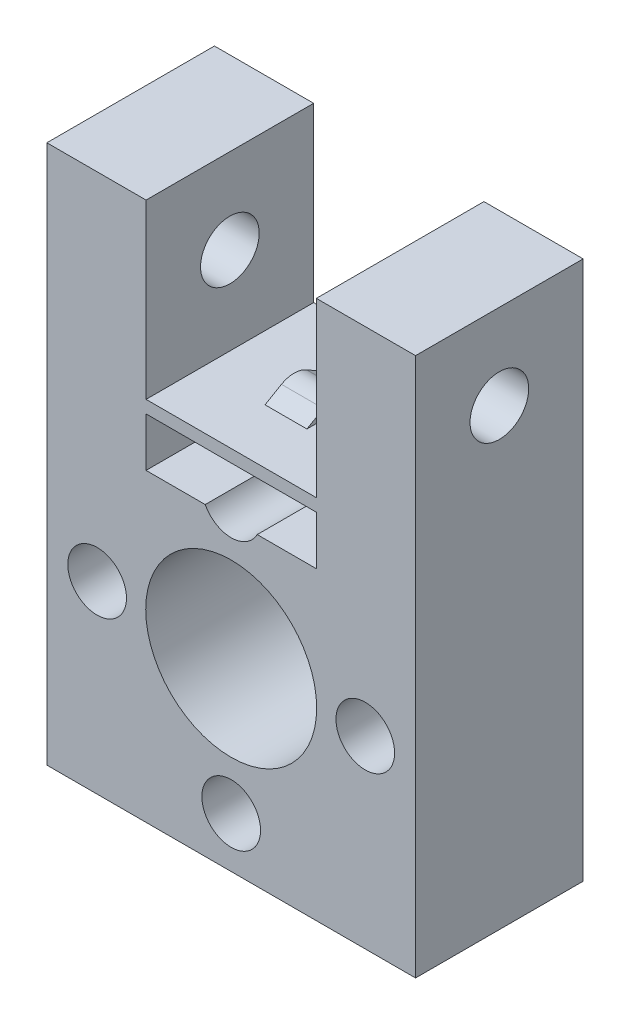
ISO-10303-21;
HEADER;
FILE_DESCRIPTION(('STEP AP214'),'2;1');
FILE_NAME('part.step','',(''),(''),'','','');
FILE_SCHEMA(('AUTOMOTIVE_DESIGN { 1 0 10303 214 1 1 1 1 }'));
ENDSEC;
DATA;
#1=APPLICATION_CONTEXT('core data for automotive mechanical design processes');
#2=APPLICATION_PROTOCOL_DEFINITION('international standard','automotive_design',2000,#1);
#3=PRODUCT_CONTEXT('',#1,'mechanical');
#4=PRODUCT('Part','Part','',(#3));
#5=PRODUCT_RELATED_PRODUCT_CATEGORY('part','',(#4));
#6=PRODUCT_DEFINITION_FORMATION('','',#4);
#7=PRODUCT_DEFINITION_CONTEXT('part definition',#1,'design');
#8=PRODUCT_DEFINITION('design','',#6,#7);
#9=PRODUCT_DEFINITION_SHAPE('','',#8);
#10=(LENGTH_UNIT() NAMED_UNIT(*) SI_UNIT(.MILLI.,.METRE.));
#11=(NAMED_UNIT(*) PLANE_ANGLE_UNIT() SI_UNIT($,.RADIAN.));
#12=(NAMED_UNIT(*) SI_UNIT($,.STERADIAN.) SOLID_ANGLE_UNIT());
#13=UNCERTAINTY_MEASURE_WITH_UNIT(LENGTH_MEASURE(1.E-05),#10,'distance_accuracy_value','');
#14=(GEOMETRIC_REPRESENTATION_CONTEXT(3) GLOBAL_UNCERTAINTY_ASSIGNED_CONTEXT((#13)) GLOBAL_UNIT_ASSIGNED_CONTEXT((#10,
#11,#12)) REPRESENTATION_CONTEXT('',''));
#15=CARTESIAN_POINT('',(0.,0.,0.));
#16=DIRECTION('',(0.,0.,1.));
#17=DIRECTION('',(1.,0.,0.));
#18=AXIS2_PLACEMENT_3D('',#15,#16,#17);
#19=CARTESIAN_POINT('',(5.08,21.16,0.));
#20=DIRECTION('',(1.,0.,0.));
#21=DIRECTION('',(0.,1.,0.));
#22=AXIS2_PLACEMENT_3D('',#19,#20,#21);
#23=PLANE('',#22);
#24=DIRECTION('',(0.,0.,1.));
#25=VECTOR('',#24,1.);
#26=CARTESIAN_POINT('',(5.08,10.11,0.));
#27=LINE('',#26,#25);
#28=CARTESIAN_POINT('',(5.08,10.11,0.));
#29=VERTEX_POINT('',#28);
#30=CARTESIAN_POINT('',(5.08,10.11,10.));
#31=VERTEX_POINT('',#30);
#32=EDGE_CURVE('E248',#29,#31,#27,.T.);
#33=ORIENTED_EDGE('',*,*,#32,.F.);
#34=DIRECTION('',(0.,1.,0.));
#35=VECTOR('',#34,1.);
#36=CARTESIAN_POINT('',(5.08,21.16,0.));
#37=LINE('',#36,#35);
#38=CARTESIAN_POINT('',(5.08,7.19,0.));
#39=VERTEX_POINT('',#38);
#40=EDGE_CURVE('E292',#39,#29,#37,.T.);
#41=ORIENTED_EDGE('',*,*,#40,.F.);
#42=DIRECTION('',(0.,0.,1.));
#43=VECTOR('',#42,1.);
#44=CARTESIAN_POINT('',(5.08,7.19,0.));
#45=LINE('',#44,#43);
#46=CARTESIAN_POINT('',(5.08,7.19,10.));
#47=VERTEX_POINT('',#46);
#48=EDGE_CURVE('E318',#39,#47,#45,.T.);
#49=ORIENTED_EDGE('',*,*,#48,.T.);
#50=DIRECTION('',(0.,1.,0.));
#51=VECTOR('',#50,1.);
#52=CARTESIAN_POINT('',(5.08,21.16,10.));
#53=LINE('',#52,#51);
#54=EDGE_CURVE('E306',#47,#31,#53,.T.);
#55=ORIENTED_EDGE('',*,*,#54,.T.);
#56=EDGE_LOOP('',(#33,#41,#49,#55));
#57=FACE_BOUND('',#56,.T.);
#58=ADVANCED_FACE('F67',(#57),#23,.F.);
#59=CARTESIAN_POINT('',(-5.08,21.16,0.));
#60=DIRECTION('',(-1.,0.,0.));
#61=DIRECTION('',(0.,-1.,0.));
#62=AXIS2_PLACEMENT_3D('',#59,#60,#61);
#63=PLANE('',#62);
#64=DIRECTION('',(0.,0.,-1.));
#65=VECTOR('',#64,1.);
#66=CARTESIAN_POINT('',(-5.08,10.11,0.));
#67=LINE('',#66,#65);
#68=CARTESIAN_POINT('',(-5.08,10.11,10.));
#69=VERTEX_POINT('',#68);
#70=CARTESIAN_POINT('',(-5.08,10.11,0.));
#71=VERTEX_POINT('',#70);
#72=EDGE_CURVE('E409',#69,#71,#67,.T.);
#73=ORIENTED_EDGE('',*,*,#72,.F.);
#74=DIRECTION('',(0.,-1.,0.));
#75=VECTOR('',#74,1.);
#76=CARTESIAN_POINT('',(-5.08,21.16,10.));
#77=LINE('',#76,#75);
#78=CARTESIAN_POINT('',(-5.08,7.19,10.));
#79=VERTEX_POINT('',#78);
#80=EDGE_CURVE('E280',#69,#79,#77,.T.);
#81=ORIENTED_EDGE('',*,*,#80,.T.);
#82=DIRECTION('',(0.,0.,1.));
#83=VECTOR('',#82,1.);
#84=CARTESIAN_POINT('',(-5.08,7.19,0.));
#85=LINE('',#84,#83);
#86=CARTESIAN_POINT('',(-5.08,7.19,0.));
#87=VERTEX_POINT('',#86);
#88=EDGE_CURVE('E296',#87,#79,#85,.T.);
#89=ORIENTED_EDGE('',*,*,#88,.F.);
#90=DIRECTION('',(0.,-1.,0.));
#91=VECTOR('',#90,1.);
#92=CARTESIAN_POINT('',(-5.08,21.16,0.));
#93=LINE('',#92,#91);
#94=EDGE_CURVE('E286',#71,#87,#93,.T.);
#95=ORIENTED_EDGE('',*,*,#94,.F.);
#96=EDGE_LOOP('',(#73,#81,#89,#95));
#97=FACE_BOUND('',#96,.T.);
#98=ADVANCED_FACE('F431',(#97),#63,.F.);
#99=CARTESIAN_POINT('',(0.,21.16,0.));
#100=DIRECTION('',(0.,-1.,0.));
#101=DIRECTION('',(0.,0.,-1.));
#102=AXIS2_PLACEMENT_3D('',#99,#100,#101);
#103=PLANE('',#102);
#104=DIRECTION('',(1.,0.,0.));
#105=VECTOR('',#104,1.);
#106=CARTESIAN_POINT('',(-11.,21.16,10.));
#107=LINE('',#106,#105);
#108=CARTESIAN_POINT('',(-11.,21.16,10.));
#109=VERTEX_POINT('',#108);
#110=CARTESIAN_POINT('',(-5.08,21.16,10.));
#111=VERTEX_POINT('',#110);
#112=EDGE_CURVE('E325',#109,#111,#107,.T.);
#113=ORIENTED_EDGE('',*,*,#112,.T.);
#114=DIRECTION('',(0.,0.,1.));
#115=VECTOR('',#114,1.);
#116=CARTESIAN_POINT('',(-5.08,21.16,0.));
#117=LINE('',#116,#115);
#118=CARTESIAN_POINT('',(-5.08,21.16,0.));
#119=VERTEX_POINT('',#118);
#120=EDGE_CURVE('E310',#119,#111,#117,.T.);
#121=ORIENTED_EDGE('',*,*,#120,.F.);
#122=DIRECTION('',(1.,0.,0.));
#123=VECTOR('',#122,1.);
#124=CARTESIAN_POINT('',(-11.,21.16,0.));
#125=LINE('',#124,#123);
#126=CARTESIAN_POINT('',(-11.,21.16,0.));
#127=VERTEX_POINT('',#126);
#128=EDGE_CURVE('E334',#127,#119,#125,.T.);
#129=ORIENTED_EDGE('',*,*,#128,.F.);
#130=DIRECTION('',(0.,0.,1.));
#131=VECTOR('',#130,1.);
#132=CARTESIAN_POINT('',(-11.,21.16,0.));
#133=LINE('',#132,#131);
#134=EDGE_CURVE('E338',#127,#109,#133,.T.);
#135=ORIENTED_EDGE('',*,*,#134,.T.);
#136=EDGE_LOOP('',(#113,#121,#129,#135));
#137=FACE_BOUND('',#136,.T.);
#138=ADVANCED_FACE('F474',(#137),#103,.F.);
#139=CARTESIAN_POINT('',(0.,0.,10.));
#140=DIRECTION('',(0.,0.,1.));
#141=DIRECTION('',(1.,0.,0.));
#142=AXIS2_PLACEMENT_3D('',#139,#140,#141);
#143=PLANE('',#142);
#144=DIRECTION('',(1.,0.,0.));
#145=VECTOR('',#144,1.);
#146=CARTESIAN_POINT('',(-11.,10.11,10.));
#147=LINE('',#146,#145);
#148=EDGE_CURVE('E240',#69,#31,#147,.T.);
#149=ORIENTED_EDGE('',*,*,#148,.T.);
#150=ORIENTED_EDGE('',*,*,#54,.F.);
#151=DIRECTION('',(1.,0.,0.));
#152=VECTOR('',#151,1.);
#153=CARTESIAN_POINT('',(-5.08,7.19,10.));
#154=LINE('',#153,#152);
#155=CARTESIAN_POINT('',(1.55125755437322,7.19,10.));
#156=VERTEX_POINT('',#155);
#157=EDGE_CURVE('E301',#156,#47,#154,.T.);
#158=ORIENTED_EDGE('',*,*,#157,.F.);
#159=CARTESIAN_POINT('',(0.,8.,10.));
#160=DIRECTION('',(0.,0.,1.));
#161=DIRECTION('',(1.,0.,0.));
#162=AXIS2_PLACEMENT_3D('',#159,#160,#161);
#163=CIRCLE('',#162,1.75);
#164=CARTESIAN_POINT('',(-1.55125755437322,7.19,10.));
#165=VERTEX_POINT('',#164);
#166=EDGE_CURVE('E360',#165,#156,#163,.T.);
#167=ORIENTED_EDGE('',*,*,#166,.F.);
#168=EDGE_CURVE('E302',#79,#165,#154,.T.);
#169=ORIENTED_EDGE('',*,*,#168,.F.);
#170=ORIENTED_EDGE('',*,*,#80,.F.);
#171=EDGE_LOOP('',(#149,#150,#158,#167,#169,#170));
#172=FACE_BOUND('',#171,.T.);
#173=ORIENTED_EDGE('',*,*,#112,.F.);
#174=DIRECTION('',(0.,1.,0.));
#175=VECTOR('',#174,1.);
#176=CARTESIAN_POINT('',(-11.,-11.001,10.));
#177=LINE('',#176,#175);
#178=CARTESIAN_POINT('',(-11.,-11.,10.));
#179=VERTEX_POINT('',#178);
#180=EDGE_CURVE('E351',#179,#109,#177,.T.);
#181=ORIENTED_EDGE('',*,*,#180,.F.);
#182=DIRECTION('',(1.,0.,0.));
#183=VECTOR('',#182,1.);
#184=CARTESIAN_POINT('',(0.,-11.,10.));
#185=LINE('',#184,#183);
#186=CARTESIAN_POINT('',(11.,-11.,10.));
#187=VERTEX_POINT('',#186);
#188=EDGE_CURVE('E255',#179,#187,#185,.T.);
#189=ORIENTED_EDGE('',*,*,#188,.T.);
#190=DIRECTION('',(0.,-1.,0.));
#191=VECTOR('',#190,1.);
#192=CARTESIAN_POINT('',(11.,21.16,10.));
#193=LINE('',#192,#191);
#194=CARTESIAN_POINT('',(11.,21.16,10.));
#195=VERTEX_POINT('',#194);
#196=EDGE_CURVE('E345',#195,#187,#193,.T.);
#197=ORIENTED_EDGE('',*,*,#196,.F.);
#198=CARTESIAN_POINT('',(5.08,21.16,10.));
#199=VERTEX_POINT('',#198);
#200=EDGE_CURVE('E313',#199,#195,#107,.T.);
#201=ORIENTED_EDGE('',*,*,#200,.F.);
#202=CARTESIAN_POINT('',(5.08,10.86,10.));
#203=VERTEX_POINT('',#202);
#204=EDGE_CURVE('E305',#203,#199,#53,.T.);
#205=ORIENTED_EDGE('',*,*,#204,.F.);
#206=DIRECTION('',(1.,0.,0.));
#207=VECTOR('',#206,1.);
#208=CARTESIAN_POINT('',(-11.,10.86,10.));
#209=LINE('',#208,#207);
#210=CARTESIAN_POINT('',(-5.08,10.86,10.));
#211=VERTEX_POINT('',#210);
#212=EDGE_CURVE('E237',#211,#203,#209,.T.);
#213=ORIENTED_EDGE('',*,*,#212,.F.);
#214=EDGE_CURVE('E297',#111,#211,#77,.T.);
#215=ORIENTED_EDGE('',*,*,#214,.F.);
#216=EDGE_LOOP('',(#173,#181,#189,#197,#201,#205,#213,#215));
#217=FACE_BOUND('',#216,.T.);
#218=CARTESIAN_POINT('',(-8.,0.,10.));
#219=DIRECTION('',(0.,0.,1.));
#220=DIRECTION('',(1.,0.,0.));
#221=AXIS2_PLACEMENT_3D('',#218,#219,#220);
#222=CIRCLE('',#221,1.75);
#223=CARTESIAN_POINT('',(-6.25,0.,10.));
#224=VERTEX_POINT('',#223);
#225=EDGE_CURVE('E364',#224,#224,#222,.T.);
#226=ORIENTED_EDGE('',*,*,#225,.F.);
#227=EDGE_LOOP('',(#226));
#228=FACE_BOUND('',#227,.T.);
#229=CARTESIAN_POINT('',(8.,0.,10.));
#230=DIRECTION('',(0.,0.,1.));
#231=DIRECTION('',(1.,0.,0.));
#232=AXIS2_PLACEMENT_3D('',#229,#230,#231);
#233=CIRCLE('',#232,1.75);
#234=CARTESIAN_POINT('',(9.75,0.,10.));
#235=VERTEX_POINT('',#234);
#236=EDGE_CURVE('E372',#235,#235,#233,.T.);
#237=ORIENTED_EDGE('',*,*,#236,.F.);
#238=EDGE_LOOP('',(#237));
#239=FACE_BOUND('',#238,.T.);
#240=CARTESIAN_POINT('',(0.,-8.,10.));
#241=DIRECTION('',(0.,0.,1.));
#242=DIRECTION('',(1.,0.,0.));
#243=AXIS2_PLACEMENT_3D('',#240,#241,#242);
#244=CIRCLE('',#243,1.75);
#245=CARTESIAN_POINT('',(1.74999999999994,-8.,10.));
#246=VERTEX_POINT('',#245);
#247=EDGE_CURVE('E380',#246,#246,#244,.T.);
#248=ORIENTED_EDGE('',*,*,#247,.F.);
#249=EDGE_LOOP('',(#248));
#250=FACE_BOUND('',#249,.T.);
#251=CARTESIAN_POINT('',(0.,0.,10.));
#252=DIRECTION('',(0.,0.,1.));
#253=DIRECTION('',(1.,0.,0.));
#254=AXIS2_PLACEMENT_3D('',#251,#252,#253);
#255=CIRCLE('',#254,5.1);
#256=CARTESIAN_POINT('',(5.1,0.,10.));
#257=VERTEX_POINT('',#256);
#258=EDGE_CURVE('E387',#257,#257,#255,.T.);
#259=ORIENTED_EDGE('',*,*,#258,.F.);
#260=EDGE_LOOP('',(#259));
#261=FACE_BOUND('',#260,.T.);
#262=ADVANCED_FACE('F439',(#172,#217,#228,#239,#250,#261),#143,.T.);
#263=CARTESIAN_POINT('',(0.,0.,0.));
#264=DIRECTION('',(0.,0.,1.));
#265=DIRECTION('',(1.,0.,0.));
#266=AXIS2_PLACEMENT_3D('',#263,#264,#265);
#267=PLANE('',#266);
#268=ORIENTED_EDGE('',*,*,#40,.T.);
#269=DIRECTION('',(1.,0.,0.));
#270=VECTOR('',#269,1.);
#271=CARTESIAN_POINT('',(-11.,10.11,0.));
#272=LINE('',#271,#270);
#273=EDGE_CURVE('E203',#71,#29,#272,.T.);
#274=ORIENTED_EDGE('',*,*,#273,.F.);
#275=ORIENTED_EDGE('',*,*,#94,.T.);
#276=DIRECTION('',(1.,0.,0.));
#277=VECTOR('',#276,1.);
#278=CARTESIAN_POINT('',(-5.08,7.19,0.));
#279=LINE('',#278,#277);
#280=CARTESIAN_POINT('',(-1.55125755437322,7.19,0.));
#281=VERTEX_POINT('',#280);
#282=EDGE_CURVE('E287',#87,#281,#279,.T.);
#283=ORIENTED_EDGE('',*,*,#282,.T.);
#284=CARTESIAN_POINT('',(0.,8.,0.));
#285=DIRECTION('',(0.,0.,1.));
#286=DIRECTION('',(1.,0.,0.));
#287=AXIS2_PLACEMENT_3D('',#284,#285,#286);
#288=CIRCLE('',#287,1.75);
#289=CARTESIAN_POINT('',(1.55125755437322,7.19,0.));
#290=VERTEX_POINT('',#289);
#291=EDGE_CURVE('E355',#281,#290,#288,.T.);
#292=ORIENTED_EDGE('',*,*,#291,.T.);
#293=EDGE_CURVE('E285',#290,#39,#279,.T.);
#294=ORIENTED_EDGE('',*,*,#293,.T.);
#295=EDGE_LOOP('',(#268,#274,#275,#283,#292,#294));
#296=FACE_BOUND('',#295,.T.);
#297=CARTESIAN_POINT('',(-5.08,10.86,0.));
#298=VERTEX_POINT('',#297);
#299=EDGE_CURVE('E281',#119,#298,#93,.T.);
#300=ORIENTED_EDGE('',*,*,#299,.T.);
#301=DIRECTION('',(1.,0.,0.));
#302=VECTOR('',#301,1.);
#303=CARTESIAN_POINT('',(-11.,10.86,0.));
#304=LINE('',#303,#302);
#305=CARTESIAN_POINT('',(5.08,10.86,0.));
#306=VERTEX_POINT('',#305);
#307=EDGE_CURVE('E234',#298,#306,#304,.T.);
#308=ORIENTED_EDGE('',*,*,#307,.T.);
#309=CARTESIAN_POINT('',(5.08,21.16,0.));
#310=VERTEX_POINT('',#309);
#311=EDGE_CURVE('E291',#306,#310,#37,.T.);
#312=ORIENTED_EDGE('',*,*,#311,.T.);
#313=CARTESIAN_POINT('',(11.,21.16,0.));
#314=VERTEX_POINT('',#313);
#315=EDGE_CURVE('E333',#310,#314,#125,.T.);
#316=ORIENTED_EDGE('',*,*,#315,.T.);
#317=DIRECTION('',(0.,-1.,0.));
#318=VECTOR('',#317,1.);
#319=CARTESIAN_POINT('',(11.,21.16,0.));
#320=LINE('',#319,#318);
#321=CARTESIAN_POINT('',(11.,-11.,0.));
#322=VERTEX_POINT('',#321);
#323=EDGE_CURVE('E342',#314,#322,#320,.T.);
#324=ORIENTED_EDGE('',*,*,#323,.T.);
#325=DIRECTION('',(1.,0.,0.));
#326=VECTOR('',#325,1.);
#327=CARTESIAN_POINT('',(0.,-11.,0.));
#328=LINE('',#327,#326);
#329=CARTESIAN_POINT('',(-11.,-11.,0.));
#330=VERTEX_POINT('',#329);
#331=EDGE_CURVE('E256',#330,#322,#328,.T.);
#332=ORIENTED_EDGE('',*,*,#331,.F.);
#333=DIRECTION('',(0.,1.,0.));
#334=VECTOR('',#333,1.);
#335=CARTESIAN_POINT('',(-11.,-11.001,0.));
#336=LINE('',#335,#334);
#337=EDGE_CURVE('E348',#330,#127,#336,.T.);
#338=ORIENTED_EDGE('',*,*,#337,.T.);
#339=ORIENTED_EDGE('',*,*,#128,.T.);
#340=EDGE_LOOP('',(#300,#308,#312,#316,#324,#332,#338,#339));
#341=FACE_BOUND('',#340,.T.);
#342=CARTESIAN_POINT('',(-8.,0.,0.));
#343=DIRECTION('',(0.,0.,1.));
#344=DIRECTION('',(1.,0.,0.));
#345=AXIS2_PLACEMENT_3D('',#342,#343,#344);
#346=CIRCLE('',#345,1.75);
#347=CARTESIAN_POINT('',(-6.25,0.,0.));
#348=VERTEX_POINT('',#347);
#349=EDGE_CURVE('E368',#348,#348,#346,.T.);
#350=ORIENTED_EDGE('',*,*,#349,.T.);
#351=EDGE_LOOP('',(#350));
#352=FACE_BOUND('',#351,.T.);
#353=CARTESIAN_POINT('',(8.,0.,0.));
#354=DIRECTION('',(0.,0.,1.));
#355=DIRECTION('',(1.,0.,0.));
#356=AXIS2_PLACEMENT_3D('',#353,#354,#355);
#357=CIRCLE('',#356,1.75);
#358=CARTESIAN_POINT('',(9.75,0.,0.));
#359=VERTEX_POINT('',#358);
#360=EDGE_CURVE('E376',#359,#359,#357,.T.);
#361=ORIENTED_EDGE('',*,*,#360,.T.);
#362=EDGE_LOOP('',(#361));
#363=FACE_BOUND('',#362,.T.);
#364=CARTESIAN_POINT('',(0.,-8.,0.));
#365=DIRECTION('',(0.,0.,1.));
#366=DIRECTION('',(1.,0.,0.));
#367=AXIS2_PLACEMENT_3D('',#364,#365,#366);
#368=CIRCLE('',#367,1.75);
#369=CARTESIAN_POINT('',(1.74999999999994,-8.,0.));
#370=VERTEX_POINT('',#369);
#371=EDGE_CURVE('E354',#370,#370,#368,.T.);
#372=ORIENTED_EDGE('',*,*,#371,.T.);
#373=EDGE_LOOP('',(#372));
#374=FACE_BOUND('',#373,.T.);
#375=CARTESIAN_POINT('',(0.,0.,0.));
#376=DIRECTION('',(0.,0.,1.));
#377=DIRECTION('',(1.,0.,0.));
#378=AXIS2_PLACEMENT_3D('',#375,#376,#377);
#379=CIRCLE('',#378,5.1);
#380=CARTESIAN_POINT('',(5.1,0.,0.));
#381=VERTEX_POINT('',#380);
#382=EDGE_CURVE('E359',#381,#381,#379,.T.);
#383=ORIENTED_EDGE('',*,*,#382,.T.);
#384=EDGE_LOOP('',(#383));
#385=FACE_BOUND('',#384,.T.);
#386=ADVANCED_FACE('F447',(#296,#341,#352,#363,#374,#385),#267,.F.);
#387=CARTESIAN_POINT('',(0.,0.,10.));
#388=DIRECTION('',(0.,0.,-1.));
#389=DIRECTION('',(-1.,0.,0.));
#390=AXIS2_PLACEMENT_3D('',#387,#388,#389);
#391=CYLINDRICAL_SURFACE('',#390,5.1);
#392=ORIENTED_EDGE('',*,*,#258,.T.);
#393=EDGE_LOOP('',(#392));
#394=FACE_BOUND('',#393,.T.);
#395=ORIENTED_EDGE('',*,*,#382,.F.);
#396=EDGE_LOOP('',(#395));
#397=FACE_BOUND('',#396,.T.);
#398=ADVANCED_FACE('F659',(#394,#397),#391,.F.);
#399=CARTESIAN_POINT('',(0.,-8.,0.));
#400=DIRECTION('',(0.,0.,1.));
#401=DIRECTION('',(1.,0.,0.));
#402=AXIS2_PLACEMENT_3D('',#399,#400,#401);
#403=CYLINDRICAL_SURFACE('',#402,1.75);
#404=ORIENTED_EDGE('',*,*,#371,.F.);
#405=EDGE_LOOP('',(#404));
#406=FACE_BOUND('',#405,.T.);
#407=ORIENTED_EDGE('',*,*,#247,.T.);
#408=EDGE_LOOP('',(#407));
#409=FACE_BOUND('',#408,.T.);
#410=ADVANCED_FACE('F650',(#406,#409),#403,.F.);
#411=CARTESIAN_POINT('',(8.,0.,0.));
#412=DIRECTION('',(0.,0.,1.));
#413=DIRECTION('',(1.,0.,0.));
#414=AXIS2_PLACEMENT_3D('',#411,#412,#413);
#415=CYLINDRICAL_SURFACE('',#414,1.75);
#416=ORIENTED_EDGE('',*,*,#360,.F.);
#417=EDGE_LOOP('',(#416));
#418=FACE_BOUND('',#417,.T.);
#419=ORIENTED_EDGE('',*,*,#236,.T.);
#420=EDGE_LOOP('',(#419));
#421=FACE_BOUND('',#420,.T.);
#422=ADVANCED_FACE('F641',(#418,#421),#415,.F.);
#423=CARTESIAN_POINT('',(-8.,0.,0.));
#424=DIRECTION('',(0.,0.,1.));
#425=DIRECTION('',(1.,0.,0.));
#426=AXIS2_PLACEMENT_3D('',#423,#424,#425);
#427=CYLINDRICAL_SURFACE('',#426,1.75);
#428=ORIENTED_EDGE('',*,*,#349,.F.);
#429=EDGE_LOOP('',(#428));
#430=FACE_BOUND('',#429,.T.);
#431=ORIENTED_EDGE('',*,*,#225,.T.);
#432=EDGE_LOOP('',(#431));
#433=FACE_BOUND('',#432,.T.);
#434=ADVANCED_FACE('F633',(#430,#433),#427,.F.);
#435=CARTESIAN_POINT('',(0.,8.,0.));
#436=DIRECTION('',(0.,0.,1.));
#437=DIRECTION('',(1.,0.,0.));
#438=AXIS2_PLACEMENT_3D('',#435,#436,#437);
#439=CYLINDRICAL_SURFACE('',#438,1.75);
#440=ORIENTED_EDGE('',*,*,#166,.T.);
#441=DIRECTION('',(0.,0.,1.));
#442=VECTOR('',#441,1.);
#443=CARTESIAN_POINT('',(1.55125755437322,7.19,0.));
#444=LINE('',#443,#442);
#445=EDGE_CURVE('E398',#156,#290,#444,.F.);
#446=ORIENTED_EDGE('',*,*,#445,.T.);
#447=ORIENTED_EDGE('',*,*,#291,.F.);
#448=DIRECTION('',(0.,0.,1.));
#449=VECTOR('',#448,1.);
#450=CARTESIAN_POINT('',(-1.55125755437322,7.19,0.));
#451=LINE('',#450,#449);
#452=EDGE_CURVE('E391',#281,#165,#451,.T.);
#453=ORIENTED_EDGE('',*,*,#452,.T.);
#454=EDGE_LOOP('',(#440,#446,#447,#453));
#455=FACE_BOUND('',#454,.T.);
#456=ADVANCED_FACE('F444',(#455),#439,.F.);
#457=CARTESIAN_POINT('',(-11.,-11.001,10.));
#458=DIRECTION('',(1.,0.,0.));
#459=DIRECTION('',(0.,0.,-1.));
#460=AXIS2_PLACEMENT_3D('',#457,#458,#459);
#461=PLANE('',#460);
#462=CARTESIAN_POINT('',(-11.,16.08,5.));
#463=DIRECTION('',(1.,0.,0.));
#464=DIRECTION('',(0.,0.,-1.));
#465=AXIS2_PLACEMENT_3D('',#462,#463,#464);
#466=CIRCLE('',#465,1.75);
#467=CARTESIAN_POINT('',(-11.,16.08,3.25));
#468=VERTEX_POINT('',#467);
#469=EDGE_CURVE('E268',#468,#468,#466,.T.);
#470=ORIENTED_EDGE('',*,*,#469,.T.);
#471=EDGE_LOOP('',(#470));
#472=FACE_BOUND('',#471,.T.);
#473=ORIENTED_EDGE('',*,*,#134,.F.);
#474=ORIENTED_EDGE('',*,*,#337,.F.);
#475=DIRECTION('',(0.,0.,1.));
#476=VECTOR('',#475,1.);
#477=CARTESIAN_POINT('',(-11.,-11.,0.));
#478=LINE('',#477,#476);
#479=EDGE_CURVE('E260',#330,#179,#478,.T.);
#480=ORIENTED_EDGE('',*,*,#479,.T.);
#481=ORIENTED_EDGE('',*,*,#180,.T.);
#482=EDGE_LOOP('',(#473,#474,#480,#481));
#483=FACE_BOUND('',#482,.T.);
#484=ADVANCED_FACE('F600',(#472,#483),#461,.F.);
#485=CARTESIAN_POINT('',(11.,21.16,0.));
#486=DIRECTION('',(1.,0.,0.));
#487=DIRECTION('',(0.,0.,-1.));
#488=AXIS2_PLACEMENT_3D('',#485,#486,#487);
#489=PLANE('',#488);
#490=ORIENTED_EDGE('',*,*,#196,.T.);
#491=DIRECTION('',(0.,0.,1.));
#492=VECTOR('',#491,1.);
#493=CARTESIAN_POINT('',(11.,-11.,0.));
#494=LINE('',#493,#492);
#495=EDGE_CURVE('E251',#322,#187,#494,.T.);
#496=ORIENTED_EDGE('',*,*,#495,.F.);
#497=ORIENTED_EDGE('',*,*,#323,.F.);
#498=DIRECTION('',(0.,0.,1.));
#499=VECTOR('',#498,1.);
#500=CARTESIAN_POINT('',(11.,21.16,0.));
#501=LINE('',#500,#499);
#502=EDGE_CURVE('E329',#314,#195,#501,.T.);
#503=ORIENTED_EDGE('',*,*,#502,.T.);
#504=EDGE_LOOP('',(#490,#496,#497,#503));
#505=FACE_BOUND('',#504,.T.);
#506=CARTESIAN_POINT('',(11.,16.08,5.));
#507=DIRECTION('',(1.,0.,0.));
#508=DIRECTION('',(0.,0.,-1.));
#509=AXIS2_PLACEMENT_3D('',#506,#507,#508);
#510=CIRCLE('',#509,1.75);
#511=CARTESIAN_POINT('',(11.,16.08,3.25));
#512=VERTEX_POINT('',#511);
#513=EDGE_CURVE('E267',#512,#512,#510,.T.);
#514=ORIENTED_EDGE('',*,*,#513,.F.);
#515=EDGE_LOOP('',(#514));
#516=FACE_BOUND('',#515,.T.);
#517=ADVANCED_FACE('F605',(#505,#516),#489,.T.);
#518=ORIENTED_EDGE('',*,*,#315,.F.);
#519=DIRECTION('',(0.,0.,1.));
#520=VECTOR('',#519,1.);
#521=CARTESIAN_POINT('',(5.08,21.16,0.));
#522=LINE('',#521,#520);
#523=EDGE_CURVE('E314',#310,#199,#522,.T.);
#524=ORIENTED_EDGE('',*,*,#523,.T.);
#525=ORIENTED_EDGE('',*,*,#200,.T.);
#526=ORIENTED_EDGE('',*,*,#502,.F.);
#527=EDGE_LOOP('',(#518,#524,#525,#526));
#528=FACE_BOUND('',#527,.T.);
#529=ADVANCED_FACE('F465',(#528),#103,.F.);
#530=CARTESIAN_POINT('',(5.08,16.08,5.));
#531=DIRECTION('',(1.,0.,0.));
#532=DIRECTION('',(0.,1.,0.));
#533=AXIS2_PLACEMENT_3D('',#530,#531,#532);
#534=CIRCLE('',#533,1.75);
#535=CARTESIAN_POINT('',(5.08,17.83,5.));
#536=VERTEX_POINT('',#535);
#537=EDGE_CURVE('E276',#536,#536,#534,.T.);
#538=ORIENTED_EDGE('',*,*,#537,.T.);
#539=EDGE_LOOP('',(#538));
#540=FACE_BOUND('',#539,.T.);
#541=ORIENTED_EDGE('',*,*,#311,.F.);
#542=DIRECTION('',(0.,0.,1.));
#543=VECTOR('',#542,1.);
#544=CARTESIAN_POINT('',(5.08,10.86,0.));
#545=LINE('',#544,#543);
#546=EDGE_CURVE('E244',#306,#203,#545,.T.);
#547=ORIENTED_EDGE('',*,*,#546,.T.);
#548=ORIENTED_EDGE('',*,*,#204,.T.);
#549=ORIENTED_EDGE('',*,*,#523,.F.);
#550=EDGE_LOOP('',(#541,#547,#548,#549));
#551=FACE_BOUND('',#550,.T.);
#552=ADVANCED_FACE('F457',(#540,#551),#23,.F.);
#553=CARTESIAN_POINT('',(-5.08,7.19,0.));
#554=DIRECTION('',(0.,-1.,0.));
#555=DIRECTION('',(1.,0.,0.));
#556=AXIS2_PLACEMENT_3D('',#553,#554,#555);
#557=PLANE('',#556);
#558=ORIENTED_EDGE('',*,*,#157,.T.);
#559=ORIENTED_EDGE('',*,*,#48,.F.);
#560=ORIENTED_EDGE('',*,*,#293,.F.);
#561=ORIENTED_EDGE('',*,*,#445,.F.);
#562=EDGE_LOOP('',(#558,#559,#560,#561));
#563=FACE_BOUND('',#562,.T.);
#564=ADVANCED_FACE('F455',(#563),#557,.F.);
#565=ORIENTED_EDGE('',*,*,#282,.F.);
#566=ORIENTED_EDGE('',*,*,#88,.T.);
#567=ORIENTED_EDGE('',*,*,#168,.T.);
#568=ORIENTED_EDGE('',*,*,#452,.F.);
#569=EDGE_LOOP('',(#565,#566,#567,#568));
#570=FACE_BOUND('',#569,.T.);
#571=ADVANCED_FACE('F437',(#570),#557,.F.);
#572=CARTESIAN_POINT('',(-5.08,16.08,5.));
#573=DIRECTION('',(-1.,0.,0.));
#574=DIRECTION('',(0.,-1.,0.));
#575=AXIS2_PLACEMENT_3D('',#572,#573,#574);
#576=CIRCLE('',#575,1.75);
#577=CARTESIAN_POINT('',(-5.08,14.33,5.));
#578=VERTEX_POINT('',#577);
#579=EDGE_CURVE('E272',#578,#578,#576,.T.);
#580=ORIENTED_EDGE('',*,*,#579,.T.);
#581=EDGE_LOOP('',(#580));
#582=FACE_BOUND('',#581,.T.);
#583=ORIENTED_EDGE('',*,*,#214,.T.);
#584=DIRECTION('',(0.,0.,-1.));
#585=VECTOR('',#584,1.);
#586=CARTESIAN_POINT('',(-5.08,10.86,0.));
#587=LINE('',#586,#585);
#588=EDGE_CURVE('E402',#211,#298,#587,.T.);
#589=ORIENTED_EDGE('',*,*,#588,.T.);
#590=ORIENTED_EDGE('',*,*,#299,.F.);
#591=ORIENTED_EDGE('',*,*,#120,.T.);
#592=EDGE_LOOP('',(#583,#589,#590,#591));
#593=FACE_BOUND('',#592,.T.);
#594=ADVANCED_FACE('F463',(#582,#593),#63,.F.);
#595=CARTESIAN_POINT('',(-11.,16.08,5.));
#596=DIRECTION('',(1.,0.,0.));
#597=DIRECTION('',(0.,0.,-1.));
#598=AXIS2_PLACEMENT_3D('',#595,#596,#597);
#599=CYLINDRICAL_SURFACE('',#598,1.75);
#600=ORIENTED_EDGE('',*,*,#469,.F.);
#601=EDGE_LOOP('',(#600));
#602=FACE_BOUND('',#601,.T.);
#603=ORIENTED_EDGE('',*,*,#579,.F.);
#604=EDGE_LOOP('',(#603));
#605=FACE_BOUND('',#604,.T.);
#606=ADVANCED_FACE('F480',(#602,#605),#599,.F.);
#607=ORIENTED_EDGE('',*,*,#513,.T.);
#608=EDGE_LOOP('',(#607));
#609=FACE_BOUND('',#608,.T.);
#610=ORIENTED_EDGE('',*,*,#537,.F.);
#611=EDGE_LOOP('',(#610));
#612=FACE_BOUND('',#611,.T.);
#613=ADVANCED_FACE('F476',(#609,#612),#599,.F.);
#614=CARTESIAN_POINT('',(0.,-11.,0.));
#615=DIRECTION('',(0.,-1.,0.));
#616=DIRECTION('',(0.,0.,-1.));
#617=AXIS2_PLACEMENT_3D('',#614,#615,#616);
#618=PLANE('',#617);
#619=ORIENTED_EDGE('',*,*,#188,.F.);
#620=ORIENTED_EDGE('',*,*,#479,.F.);
#621=ORIENTED_EDGE('',*,*,#331,.T.);
#622=ORIENTED_EDGE('',*,*,#495,.T.);
#623=EDGE_LOOP('',(#619,#620,#621,#622));
#624=FACE_BOUND('',#623,.T.);
#625=ADVANCED_FACE('F479',(#624),#618,.T.);
#626=CARTESIAN_POINT('',(-11.,10.11,0.));
#627=DIRECTION('',(0.,1.,0.));
#628=DIRECTION('',(-1.,0.,0.));
#629=AXIS2_PLACEMENT_3D('',#626,#627,#628);
#630=PLANE('',#629);
#631=ORIENTED_EDGE('',*,*,#273,.T.);
#632=ORIENTED_EDGE('',*,*,#32,.T.);
#633=ORIENTED_EDGE('',*,*,#148,.F.);
#634=ORIENTED_EDGE('',*,*,#72,.T.);
#635=EDGE_LOOP('',(#631,#632,#633,#634));
#636=FACE_BOUND('',#635,.T.);
#637=ADVANCED_FACE('F452',(#636),#630,.F.);
#638=CARTESIAN_POINT('',(-11.,10.86,0.));
#639=DIRECTION('',(0.,1.,0.));
#640=DIRECTION('',(-1.,0.,0.));
#641=AXIS2_PLACEMENT_3D('',#638,#639,#640);
#642=PLANE('',#641);
#643=DIRECTION('',(0.,0.,1.));
#644=VECTOR('',#643,1.);
#645=CARTESIAN_POINT('',(-1.25,10.86,0.));
#646=LINE('',#645,#644);
#647=CARTESIAN_POINT('',(-1.25,10.86,3.26794919243113));
#648=VERTEX_POINT('',#647);
#649=CARTESIAN_POINT('',(-1.25,10.86,6.73205080756887));
#650=VERTEX_POINT('',#649);
#651=EDGE_CURVE('E209',#648,#650,#646,.T.);
#652=ORIENTED_EDGE('',*,*,#651,.F.);
#653=DIRECTION('',(1.,0.,0.));
#654=VECTOR('',#653,1.);
#655=CARTESIAN_POINT('',(-1.25,10.86,3.26794919243113));
#656=LINE('',#655,#654);
#657=CARTESIAN_POINT('',(1.25,10.86,3.26794919243113));
#658=VERTEX_POINT('',#657);
#659=EDGE_CURVE('E192',#648,#658,#656,.T.);
#660=ORIENTED_EDGE('',*,*,#659,.T.);
#661=DIRECTION('',(0.,0.,1.));
#662=VECTOR('',#661,1.);
#663=CARTESIAN_POINT('',(1.25,10.86,0.));
#664=LINE('',#663,#662);
#665=CARTESIAN_POINT('',(1.25,10.86,6.73205080756887));
#666=VERTEX_POINT('',#665);
#667=EDGE_CURVE('E229',#658,#666,#664,.T.);
#668=ORIENTED_EDGE('',*,*,#667,.T.);
#669=DIRECTION('',(1.,0.,0.));
#670=VECTOR('',#669,1.);
#671=CARTESIAN_POINT('',(-1.25,10.86,6.73205080756887));
#672=LINE('',#671,#670);
#673=EDGE_CURVE('E204',#650,#666,#672,.T.);
#674=ORIENTED_EDGE('',*,*,#673,.F.);
#675=EDGE_LOOP('',(#652,#660,#668,#674));
#676=FACE_BOUND('',#675,.T.);
#677=ORIENTED_EDGE('',*,*,#546,.F.);
#678=ORIENTED_EDGE('',*,*,#307,.F.);
#679=ORIENTED_EDGE('',*,*,#588,.F.);
#680=ORIENTED_EDGE('',*,*,#212,.T.);
#681=EDGE_LOOP('',(#677,#678,#679,#680));
#682=FACE_BOUND('',#681,.T.);
#683=ADVANCED_FACE('F215',(#676,#682),#642,.T.);
#684=CARTESIAN_POINT('',(-1.25,11.0600635094611,6.38553064444174));
#685=DIRECTION('',(0.,0.866025403784438,0.500000000000001));
#686=DIRECTION('',(0.,-0.500000000000001,0.866025403784438));
#687=AXIS2_PLACEMENT_3D('',#684,#685,#686);
#688=PLANE('',#687);
#689=DIRECTION('',(0.,-0.500000000000001,0.866025403784438));
#690=VECTOR('',#689,1.);
#691=CARTESIAN_POINT('',(1.25,11.0600635094611,6.38553064444174));
#692=LINE('',#691,#690);
#693=CARTESIAN_POINT('',(1.25,11.4269872981078,5.75));
#694=VERTEX_POINT('',#693);
#695=EDGE_CURVE('E224',#694,#666,#692,.T.);
#696=ORIENTED_EDGE('',*,*,#695,.F.);
#697=DIRECTION('',(1.,0.,0.));
#698=VECTOR('',#697,1.);
#699=CARTESIAN_POINT('',(-1.25,11.4269872981078,5.75));
#700=LINE('',#699,#698);
#701=CARTESIAN_POINT('',(-1.25,11.4269872981078,5.75));
#702=VERTEX_POINT('',#701);
#703=EDGE_CURVE('E76',#694,#702,#700,.F.);
#704=ORIENTED_EDGE('',*,*,#703,.T.);
#705=DIRECTION('',(0.,-0.500000000000001,0.866025403784438));
#706=VECTOR('',#705,1.);
#707=CARTESIAN_POINT('',(-1.25,11.0600635094611,6.38553064444174));
#708=LINE('',#707,#706);
#709=EDGE_CURVE('E213',#702,#650,#708,.T.);
#710=ORIENTED_EDGE('',*,*,#709,.T.);
#711=ORIENTED_EDGE('',*,*,#673,.T.);
#712=EDGE_LOOP('',(#696,#704,#710,#711));
#713=FACE_BOUND('',#712,.T.);
#714=ADVANCED_FACE('F488',(#713),#688,.T.);
#715=CARTESIAN_POINT('',(-1.25,6.72993649053887,-3.88553064444173));
#716=DIRECTION('',(0.,0.866025403784437,-0.500000000000002));
#717=DIRECTION('',(0.,0.500000000000002,0.866025403784437));
#718=AXIS2_PLACEMENT_3D('',#715,#716,#717);
#719=PLANE('',#718);
#720=DIRECTION('',(0.,0.500000000000002,0.866025403784437));
#721=VECTOR('',#720,1.);
#722=CARTESIAN_POINT('',(-1.25,6.72993649053887,-3.88553064444173));
#723=LINE('',#722,#721);
#724=CARTESIAN_POINT('',(-1.25,11.4269872981078,4.24999999999999));
#725=VERTEX_POINT('',#724);
#726=EDGE_CURVE('E196',#648,#725,#723,.T.);
#727=ORIENTED_EDGE('',*,*,#726,.T.);
#728=DIRECTION('',(1.,0.,0.));
#729=VECTOR('',#728,1.);
#730=CARTESIAN_POINT('',(-1.25,11.4269872981078,4.24999999999999));
#731=LINE('',#730,#729);
#732=CARTESIAN_POINT('',(1.25,11.4269872981078,4.24999999999999));
#733=VERTEX_POINT('',#732);
#734=EDGE_CURVE('E413',#725,#733,#731,.T.);
#735=ORIENTED_EDGE('',*,*,#734,.T.);
#736=DIRECTION('',(0.,0.500000000000002,0.866025403784437));
#737=VECTOR('',#736,1.);
#738=CARTESIAN_POINT('',(1.25,6.72993649053887,-3.88553064444173));
#739=LINE('',#738,#737);
#740=EDGE_CURVE('E198',#658,#733,#739,.T.);
#741=ORIENTED_EDGE('',*,*,#740,.F.);
#742=ORIENTED_EDGE('',*,*,#659,.F.);
#743=EDGE_LOOP('',(#727,#735,#741,#742));
#744=FACE_BOUND('',#743,.T.);
#745=ADVANCED_FACE('F194',(#744),#719,.T.);
#746=CARTESIAN_POINT('',(-1.25,0.,0.));
#747=DIRECTION('',(-1.,0.,0.));
#748=DIRECTION('',(0.,-1.,0.));
#749=AXIS2_PLACEMENT_3D('',#746,#747,#748);
#750=PLANE('',#749);
#751=ORIENTED_EDGE('',*,*,#709,.F.);
#752=CARTESIAN_POINT('',(-1.25,10.1279491924311,5.));
#753=DIRECTION('',(-1.,0.,0.));
#754=DIRECTION('',(0.,-1.,0.));
#755=AXIS2_PLACEMENT_3D('',#752,#753,#754);
#756=CIRCLE('',#755,1.5);
#757=EDGE_CURVE('E12',#702,#725,#756,.T.);
#758=ORIENTED_EDGE('',*,*,#757,.T.);
#759=ORIENTED_EDGE('',*,*,#726,.F.);
#760=ORIENTED_EDGE('',*,*,#651,.T.);
#761=EDGE_LOOP('',(#751,#758,#759,#760));
#762=FACE_BOUND('',#761,.T.);
#763=ADVANCED_FACE('F208',(#762),#750,.T.);
#764=CARTESIAN_POINT('',(1.25,0.,0.));
#765=DIRECTION('',(-1.,0.,0.));
#766=DIRECTION('',(0.,-1.,0.));
#767=AXIS2_PLACEMENT_3D('',#764,#765,#766);
#768=PLANE('',#767);
#769=ORIENTED_EDGE('',*,*,#740,.T.);
#770=CARTESIAN_POINT('',(1.25,10.1279491924311,5.));
#771=DIRECTION('',(-1.,0.,0.));
#772=DIRECTION('',(0.,-1.,0.));
#773=AXIS2_PLACEMENT_3D('',#770,#771,#772);
#774=CIRCLE('',#773,1.5);
#775=EDGE_CURVE('E90',#733,#694,#774,.F.);
#776=ORIENTED_EDGE('',*,*,#775,.T.);
#777=ORIENTED_EDGE('',*,*,#695,.T.);
#778=ORIENTED_EDGE('',*,*,#667,.F.);
#779=EDGE_LOOP('',(#769,#776,#777,#778));
#780=FACE_BOUND('',#779,.T.);
#781=ADVANCED_FACE('F493',(#780),#768,.F.);
#782=CARTESIAN_POINT('',(-1.25,10.1279491924311,5.));
#783=DIRECTION('',(1.,0.,0.));
#784=DIRECTION('',(0.,1.,0.));
#785=AXIS2_PLACEMENT_3D('',#782,#783,#784);
#786=CYLINDRICAL_SURFACE('',#785,1.5);
#787=ORIENTED_EDGE('',*,*,#757,.F.);
#788=ORIENTED_EDGE('',*,*,#703,.F.);
#789=ORIENTED_EDGE('',*,*,#775,.F.);
#790=ORIENTED_EDGE('',*,*,#734,.F.);
#791=EDGE_LOOP('',(#787,#788,#789,#790));
#792=FACE_BOUND('',#791,.T.);
#793=ADVANCED_FACE('F69',(#792),#786,.T.);
#794=CLOSED_SHELL('',(#58,#98,#138,#262,#386,#398,#410,#422,#434,#456,#484,#517,#529,#552,#564,
#571,#594,#606,#613,#625,#637,#683,#714,#745,#763,#781,#793));
#795=MANIFOLD_SOLID_BREP('B2',#794);
#796=ADVANCED_BREP_SHAPE_REPRESENTATION('',(#18,#795),#14);
#797=SHAPE_DEFINITION_REPRESENTATION(#9,#796);
ENDSEC;
END-ISO-10303-21;
